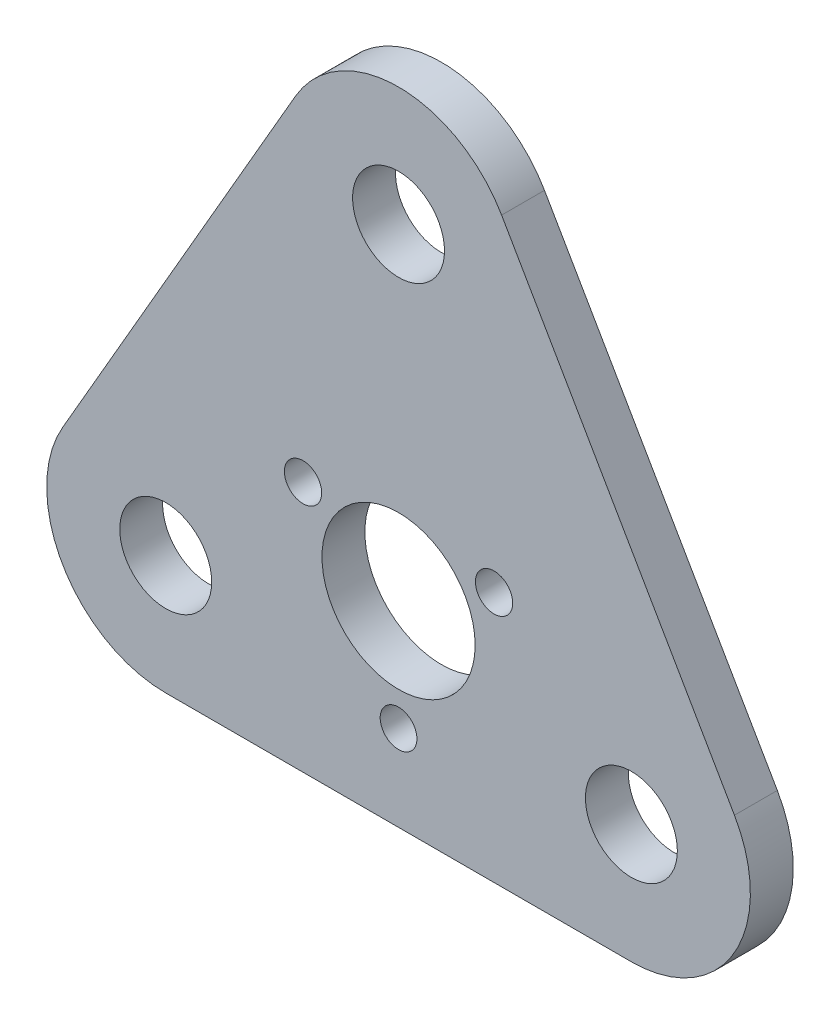
ISO-10303-21;
HEADER;
FILE_DESCRIPTION(('STEP AP214'),'2;1');
FILE_NAME('part.step','',(''),(''),'','','');
FILE_SCHEMA(('AUTOMOTIVE_DESIGN { 1 0 10303 214 1 1 1 1 }'));
ENDSEC;
DATA;
#1=APPLICATION_CONTEXT('core data for automotive mechanical design processes');
#2=APPLICATION_PROTOCOL_DEFINITION('international standard','automotive_design',2000,#1);
#3=PRODUCT_CONTEXT('',#1,'mechanical');
#4=PRODUCT('Part','Part','',(#3));
#5=PRODUCT_RELATED_PRODUCT_CATEGORY('part','',(#4));
#6=PRODUCT_DEFINITION_FORMATION('','',#4);
#7=PRODUCT_DEFINITION_CONTEXT('part definition',#1,'design');
#8=PRODUCT_DEFINITION('design','',#6,#7);
#9=PRODUCT_DEFINITION_SHAPE('','',#8);
#10=(LENGTH_UNIT() NAMED_UNIT(*) SI_UNIT(.MILLI.,.METRE.));
#11=(NAMED_UNIT(*) PLANE_ANGLE_UNIT() SI_UNIT($,.RADIAN.));
#12=(NAMED_UNIT(*) SI_UNIT($,.STERADIAN.) SOLID_ANGLE_UNIT());
#13=UNCERTAINTY_MEASURE_WITH_UNIT(LENGTH_MEASURE(1.E-05),#10,'distance_accuracy_value','');
#14=(GEOMETRIC_REPRESENTATION_CONTEXT(3) GLOBAL_UNCERTAINTY_ASSIGNED_CONTEXT((#13)) GLOBAL_UNIT_ASSIGNED_CONTEXT((#10,
#11,#12)) REPRESENTATION_CONTEXT('',''));
#15=CARTESIAN_POINT('',(0.,0.,0.));
#16=DIRECTION('',(0.,0.,1.));
#17=DIRECTION('',(1.,0.,0.));
#18=AXIS2_PLACEMENT_3D('',#15,#16,#17);
#19=CARTESIAN_POINT('',(38.,-20.3333333333336,7.));
#20=DIRECTION('',(0.,0.,1.));
#21=DIRECTION('',(1.,0.,0.));
#22=AXIS2_PLACEMENT_3D('',#19,#20,#21);
#23=PLANE('',#22);
#24=CARTESIAN_POINT('',(-15.5884572681199,1.2449822014677,7.));
#25=DIRECTION('',(0.,0.,1.));
#26=DIRECTION('',(1.,0.,0.));
#27=AXIS2_PLACEMENT_3D('',#24,#25,#26);
#28=CIRCLE('',#27,3.04265323626427);
#29=CARTESIAN_POINT('',(-12.5458040318556,1.2449822014677,7.));
#30=VERTEX_POINT('',#29);
#31=EDGE_CURVE('E205',#30,#30,#28,.T.);
#32=ORIENTED_EDGE('',*,*,#31,.F.);
#33=EDGE_LOOP('',(#32));
#34=FACE_BOUND('',#33,.T.);
#35=CARTESIAN_POINT('',(0.,-7.75501779853232,7.));
#36=DIRECTION('',(0.,0.,1.));
#37=DIRECTION('',(1.,0.,0.));
#38=AXIS2_PLACEMENT_3D('',#35,#36,#37);
#39=CIRCLE('',#38,12.5);
#40=CARTESIAN_POINT('',(12.5,-7.75501779853232,7.));
#41=VERTEX_POINT('',#40);
#42=EDGE_CURVE('E217',#41,#41,#39,.T.);
#43=ORIENTED_EDGE('',*,*,#42,.F.);
#44=EDGE_LOOP('',(#43));
#45=FACE_BOUND('',#44,.T.);
#46=CARTESIAN_POINT('',(38.,-20.3333333333336,7.));
#47=DIRECTION('',(0.,0.,1.));
#48=DIRECTION('',(1.,0.,0.));
#49=AXIS2_PLACEMENT_3D('',#46,#47,#48);
#50=CIRCLE('',#49,7.5);
#51=CARTESIAN_POINT('',(45.5,-20.3333333333336,7.));
#52=VERTEX_POINT('',#51);
#53=EDGE_CURVE('E229',#52,#52,#50,.T.);
#54=ORIENTED_EDGE('',*,*,#53,.F.);
#55=EDGE_LOOP('',(#54));
#56=FACE_BOUND('',#55,.T.);
#57=CARTESIAN_POINT('',(38.,-20.3333333333336,7.));
#58=DIRECTION('',(0.,0.,1.));
#59=DIRECTION('',(1.,0.,0.));
#60=AXIS2_PLACEMENT_3D('',#57,#58,#59);
#61=CIRCLE('',#60,19.4216844651987);
#62=CARTESIAN_POINT('',(38.,-39.7550177985323,7.));
#63=VERTEX_POINT('',#62);
#64=CARTESIAN_POINT('',(54.8196721311476,-10.6224911007343,7.));
#65=VERTEX_POINT('',#64);
#66=EDGE_CURVE('E133',#63,#65,#61,.T.);
#67=ORIENTED_EDGE('',*,*,#66,.T.);
#68=DIRECTION('',(-0.5,0.866025403784439,0.));
#69=VECTOR('',#68,1.);
#70=CARTESIAN_POINT('',(54.8196721311476,-10.6224911007343,7.));
#71=LINE('',#70,#69);
#72=CARTESIAN_POINT('',(16.8196721311476,55.195439586883,7.));
#73=VERTEX_POINT('',#72);
#74=EDGE_CURVE('E91',#65,#73,#71,.T.);
#75=ORIENTED_EDGE('',*,*,#74,.T.);
#76=CARTESIAN_POINT('',(0.,45.4845973542837,7.));
#77=DIRECTION('',(0.,0.,1.));
#78=DIRECTION('',(-1.,0.,0.));
#79=AXIS2_PLACEMENT_3D('',#76,#77,#78);
#80=CIRCLE('',#79,19.4216844651987);
#81=CARTESIAN_POINT('',(-16.8196721311476,55.195439586883,7.));
#82=VERTEX_POINT('',#81);
#83=EDGE_CURVE('E104',#73,#82,#80,.T.);
#84=ORIENTED_EDGE('',*,*,#83,.T.);
#85=DIRECTION('',(-0.5,-0.866025403784438,0.));
#86=VECTOR('',#85,1.);
#87=CARTESIAN_POINT('',(-16.8196721311476,55.195439586883,7.));
#88=LINE('',#87,#86);
#89=CARTESIAN_POINT('',(-54.8196721311476,-10.6224911007343,7.));
#90=VERTEX_POINT('',#89);
#91=EDGE_CURVE('E98',#82,#90,#88,.T.);
#92=ORIENTED_EDGE('',*,*,#91,.T.);
#93=CARTESIAN_POINT('',(-38.,-20.3333333333337,7.));
#94=DIRECTION('',(0.,0.,1.));
#95=DIRECTION('',(1.,0.,0.));
#96=AXIS2_PLACEMENT_3D('',#93,#94,#95);
#97=CIRCLE('',#96,19.4216844651987);
#98=CARTESIAN_POINT('',(-38.,-39.7550177985323,7.));
#99=VERTEX_POINT('',#98);
#100=EDGE_CURVE('E102',#90,#99,#97,.T.);
#101=ORIENTED_EDGE('',*,*,#100,.T.);
#102=DIRECTION('',(1.,0.,0.));
#103=VECTOR('',#102,1.);
#104=CARTESIAN_POINT('',(-38.,-39.7550177985323,7.));
#105=LINE('',#104,#103);
#106=EDGE_CURVE('E54',#99,#63,#105,.T.);
#107=ORIENTED_EDGE('',*,*,#106,.T.);
#108=EDGE_LOOP('',(#67,#75,#84,#92,#101,#107));
#109=FACE_BOUND('',#108,.T.);
#110=CARTESIAN_POINT('',(0.,45.4845973542837,7.));
#111=DIRECTION('',(0.,0.,1.));
#112=DIRECTION('',(1.,0.,0.));
#113=AXIS2_PLACEMENT_3D('',#110,#111,#112);
#114=CIRCLE('',#113,7.5);
#115=CARTESIAN_POINT('',(7.5,45.4845973542837,7.));
#116=VERTEX_POINT('',#115);
#117=EDGE_CURVE('E126',#116,#116,#114,.T.);
#118=ORIENTED_EDGE('',*,*,#117,.F.);
#119=EDGE_LOOP('',(#118));
#120=FACE_BOUND('',#119,.T.);
#121=CARTESIAN_POINT('',(-38.,-20.3333333333337,7.));
#122=DIRECTION('',(0.,0.,1.));
#123=DIRECTION('',(1.,0.,0.));
#124=AXIS2_PLACEMENT_3D('',#121,#122,#123);
#125=CIRCLE('',#124,7.5);
#126=CARTESIAN_POINT('',(-30.5,-20.3333333333337,7.));
#127=VERTEX_POINT('',#126);
#128=EDGE_CURVE('E223',#127,#127,#125,.T.);
#129=ORIENTED_EDGE('',*,*,#128,.F.);
#130=EDGE_LOOP('',(#129));
#131=FACE_BOUND('',#130,.T.);
#132=CARTESIAN_POINT('',(0.,-25.7550177985323,7.));
#133=DIRECTION('',(0.,0.,1.));
#134=DIRECTION('',(1.,0.,0.));
#135=AXIS2_PLACEMENT_3D('',#132,#133,#134);
#136=CIRCLE('',#135,3.);
#137=CARTESIAN_POINT('',(3.,-25.7550177985323,7.));
#138=VERTEX_POINT('',#137);
#139=EDGE_CURVE('E211',#138,#138,#136,.T.);
#140=ORIENTED_EDGE('',*,*,#139,.F.);
#141=EDGE_LOOP('',(#140));
#142=FACE_BOUND('',#141,.T.);
#143=CARTESIAN_POINT('',(15.5884572681199,1.2449822014677,7.));
#144=DIRECTION('',(0.,0.,1.));
#145=DIRECTION('',(-1.,0.,0.));
#146=AXIS2_PLACEMENT_3D('',#143,#144,#145);
#147=CIRCLE('',#146,3.04265323626427);
#148=CARTESIAN_POINT('',(12.5458040318556,1.2449822014677,7.));
#149=VERTEX_POINT('',#148);
#150=EDGE_CURVE('E196',#149,#149,#147,.T.);
#151=ORIENTED_EDGE('',*,*,#150,.F.);
#152=EDGE_LOOP('',(#151));
#153=FACE_BOUND('',#152,.T.);
#154=ADVANCED_FACE('F37',(#34,#45,#56,#109,#120,#131,#142,#153),#23,.T.);
#155=CARTESIAN_POINT('',(38.,-20.3333333333336,0.));
#156=DIRECTION('',(0.,0.,1.));
#157=DIRECTION('',(1.,0.,0.));
#158=AXIS2_PLACEMENT_3D('',#155,#156,#157);
#159=PLANE('',#158);
#160=CARTESIAN_POINT('',(38.,-20.3333333333336,0.));
#161=DIRECTION('',(0.,0.,1.));
#162=DIRECTION('',(1.,0.,0.));
#163=AXIS2_PLACEMENT_3D('',#160,#161,#162);
#164=CIRCLE('',#163,19.4216844651987);
#165=CARTESIAN_POINT('',(38.,-39.7550177985323,0.));
#166=VERTEX_POINT('',#165);
#167=CARTESIAN_POINT('',(54.8196721311476,-10.6224911007343,0.));
#168=VERTEX_POINT('',#167);
#169=EDGE_CURVE('E122',#166,#168,#164,.T.);
#170=ORIENTED_EDGE('',*,*,#169,.F.);
#171=DIRECTION('',(1.,0.,0.));
#172=VECTOR('',#171,1.);
#173=CARTESIAN_POINT('',(-38.,-39.7550177985323,0.));
#174=LINE('',#173,#172);
#175=CARTESIAN_POINT('',(-38.,-39.7550177985323,0.));
#176=VERTEX_POINT('',#175);
#177=EDGE_CURVE('E83',#176,#166,#174,.T.);
#178=ORIENTED_EDGE('',*,*,#177,.F.);
#179=CARTESIAN_POINT('',(-38.,-20.3333333333337,0.));
#180=DIRECTION('',(0.,0.,1.));
#181=DIRECTION('',(1.,0.,0.));
#182=AXIS2_PLACEMENT_3D('',#179,#180,#181);
#183=CIRCLE('',#182,19.4216844651987);
#184=CARTESIAN_POINT('',(-54.8196721311476,-10.6224911007343,0.));
#185=VERTEX_POINT('',#184);
#186=EDGE_CURVE('E77',#185,#176,#183,.T.);
#187=ORIENTED_EDGE('',*,*,#186,.F.);
#188=DIRECTION('',(-0.5,-0.866025403784438,0.));
#189=VECTOR('',#188,1.);
#190=CARTESIAN_POINT('',(-16.8196721311476,55.195439586883,0.));
#191=LINE('',#190,#189);
#192=CARTESIAN_POINT('',(-16.8196721311476,55.195439586883,0.));
#193=VERTEX_POINT('',#192);
#194=EDGE_CURVE('E112',#193,#185,#191,.T.);
#195=ORIENTED_EDGE('',*,*,#194,.F.);
#196=CARTESIAN_POINT('',(0.,45.4845973542837,0.));
#197=DIRECTION('',(0.,0.,1.));
#198=DIRECTION('',(-1.,0.,0.));
#199=AXIS2_PLACEMENT_3D('',#196,#197,#198);
#200=CIRCLE('',#199,19.4216844651987);
#201=CARTESIAN_POINT('',(16.8196721311476,55.195439586883,0.));
#202=VERTEX_POINT('',#201);
#203=EDGE_CURVE('E128',#202,#193,#200,.T.);
#204=ORIENTED_EDGE('',*,*,#203,.F.);
#205=DIRECTION('',(-0.5,0.866025403784439,0.));
#206=VECTOR('',#205,1.);
#207=CARTESIAN_POINT('',(54.8196721311476,-10.6224911007343,0.));
#208=LINE('',#207,#206);
#209=EDGE_CURVE('E125',#168,#202,#208,.T.);
#210=ORIENTED_EDGE('',*,*,#209,.F.);
#211=EDGE_LOOP('',(#170,#178,#187,#195,#204,#210));
#212=FACE_BOUND('',#211,.T.);
#213=CARTESIAN_POINT('',(0.,45.4845973542837,0.));
#214=DIRECTION('',(0.,0.,1.));
#215=DIRECTION('',(1.,0.,0.));
#216=AXIS2_PLACEMENT_3D('',#213,#214,#215);
#217=CIRCLE('',#216,7.5);
#218=CARTESIAN_POINT('',(7.5,45.4845973542837,0.));
#219=VERTEX_POINT('',#218);
#220=EDGE_CURVE('E232',#219,#219,#217,.T.);
#221=ORIENTED_EDGE('',*,*,#220,.T.);
#222=EDGE_LOOP('',(#221));
#223=FACE_BOUND('',#222,.T.);
#224=CARTESIAN_POINT('',(38.,-20.3333333333336,0.));
#225=DIRECTION('',(0.,0.,1.));
#226=DIRECTION('',(1.,0.,0.));
#227=AXIS2_PLACEMENT_3D('',#224,#225,#226);
#228=CIRCLE('',#227,7.5);
#229=CARTESIAN_POINT('',(45.5,-20.3333333333336,0.));
#230=VERTEX_POINT('',#229);
#231=EDGE_CURVE('E226',#230,#230,#228,.T.);
#232=ORIENTED_EDGE('',*,*,#231,.T.);
#233=EDGE_LOOP('',(#232));
#234=FACE_BOUND('',#233,.T.);
#235=CARTESIAN_POINT('',(-38.,-20.3333333333337,0.));
#236=DIRECTION('',(0.,0.,1.));
#237=DIRECTION('',(1.,0.,0.));
#238=AXIS2_PLACEMENT_3D('',#235,#236,#237);
#239=CIRCLE('',#238,7.5);
#240=CARTESIAN_POINT('',(-30.5,-20.3333333333337,0.));
#241=VERTEX_POINT('',#240);
#242=EDGE_CURVE('E220',#241,#241,#239,.T.);
#243=ORIENTED_EDGE('',*,*,#242,.T.);
#244=EDGE_LOOP('',(#243));
#245=FACE_BOUND('',#244,.T.);
#246=CARTESIAN_POINT('',(0.,-7.75501779853232,0.));
#247=DIRECTION('',(0.,0.,1.));
#248=DIRECTION('',(1.,0.,0.));
#249=AXIS2_PLACEMENT_3D('',#246,#247,#248);
#250=CIRCLE('',#249,12.5);
#251=CARTESIAN_POINT('',(12.5,-7.75501779853232,0.));
#252=VERTEX_POINT('',#251);
#253=EDGE_CURVE('E214',#252,#252,#250,.T.);
#254=ORIENTED_EDGE('',*,*,#253,.T.);
#255=EDGE_LOOP('',(#254));
#256=FACE_BOUND('',#255,.T.);
#257=CARTESIAN_POINT('',(0.,-25.7550177985323,0.));
#258=DIRECTION('',(0.,0.,1.));
#259=DIRECTION('',(1.,0.,0.));
#260=AXIS2_PLACEMENT_3D('',#257,#258,#259);
#261=CIRCLE('',#260,3.);
#262=CARTESIAN_POINT('',(3.,-25.7550177985323,0.));
#263=VERTEX_POINT('',#262);
#264=EDGE_CURVE('E208',#263,#263,#261,.T.);
#265=ORIENTED_EDGE('',*,*,#264,.T.);
#266=EDGE_LOOP('',(#265));
#267=FACE_BOUND('',#266,.T.);
#268=CARTESIAN_POINT('',(-15.5884572681199,1.2449822014677,0.));
#269=DIRECTION('',(0.,0.,1.));
#270=DIRECTION('',(1.,0.,0.));
#271=AXIS2_PLACEMENT_3D('',#268,#269,#270);
#272=CIRCLE('',#271,3.04265323626427);
#273=CARTESIAN_POINT('',(-12.5458040318556,1.2449822014677,0.));
#274=VERTEX_POINT('',#273);
#275=EDGE_CURVE('E202',#274,#274,#272,.T.);
#276=ORIENTED_EDGE('',*,*,#275,.T.);
#277=EDGE_LOOP('',(#276));
#278=FACE_BOUND('',#277,.T.);
#279=CARTESIAN_POINT('',(15.5884572681199,1.2449822014677,0.));
#280=DIRECTION('',(0.,0.,1.));
#281=DIRECTION('',(-1.,0.,0.));
#282=AXIS2_PLACEMENT_3D('',#279,#280,#281);
#283=CIRCLE('',#282,3.04265323626427);
#284=CARTESIAN_POINT('',(12.5458040318556,1.2449822014677,0.));
#285=VERTEX_POINT('',#284);
#286=EDGE_CURVE('E199',#285,#285,#283,.T.);
#287=ORIENTED_EDGE('',*,*,#286,.T.);
#288=EDGE_LOOP('',(#287));
#289=FACE_BOUND('',#288,.T.);
#290=ADVANCED_FACE('F142',(#212,#223,#234,#245,#256,#267,#278,#289),#159,.F.);
#291=CARTESIAN_POINT('',(38.,-20.3333333333336,7.));
#292=DIRECTION('',(0.,0.,-1.));
#293=DIRECTION('',(-1.,0.,0.));
#294=AXIS2_PLACEMENT_3D('',#291,#292,#293);
#295=CYLINDRICAL_SURFACE('',#294,19.4216844651987);
#296=ORIENTED_EDGE('',*,*,#169,.T.);
#297=DIRECTION('',(0.,0.,-1.));
#298=VECTOR('',#297,1.);
#299=CARTESIAN_POINT('',(54.8196721311476,-10.6224911007343,7.));
#300=LINE('',#299,#298);
#301=EDGE_CURVE('E11',#65,#168,#300,.T.);
#302=ORIENTED_EDGE('',*,*,#301,.F.);
#303=ORIENTED_EDGE('',*,*,#66,.F.);
#304=DIRECTION('',(0.,0.,-1.));
#305=VECTOR('',#304,1.);
#306=CARTESIAN_POINT('',(38.,-39.7550177985323,7.));
#307=LINE('',#306,#305);
#308=EDGE_CURVE('E118',#63,#166,#307,.T.);
#309=ORIENTED_EDGE('',*,*,#308,.T.);
#310=EDGE_LOOP('',(#296,#302,#303,#309));
#311=FACE_BOUND('',#310,.T.);
#312=ADVANCED_FACE('F39',(#311),#295,.T.);
#313=CARTESIAN_POINT('',(54.8196721311476,-10.6224911007343,7.));
#314=DIRECTION('',(-0.866025403784439,-0.5,0.));
#315=DIRECTION('',(0.5,-0.866025403784439,0.));
#316=AXIS2_PLACEMENT_3D('',#313,#314,#315);
#317=PLANE('',#316);
#318=ORIENTED_EDGE('',*,*,#209,.T.);
#319=DIRECTION('',(0.,0.,-1.));
#320=VECTOR('',#319,1.);
#321=CARTESIAN_POINT('',(16.8196721311476,55.195439586883,7.));
#322=LINE('',#321,#320);
#323=EDGE_CURVE('E46',#73,#202,#322,.T.);
#324=ORIENTED_EDGE('',*,*,#323,.F.);
#325=ORIENTED_EDGE('',*,*,#74,.F.);
#326=ORIENTED_EDGE('',*,*,#301,.T.);
#327=EDGE_LOOP('',(#318,#324,#325,#326));
#328=FACE_BOUND('',#327,.T.);
#329=ADVANCED_FACE('F317',(#328),#317,.F.);
#330=CARTESIAN_POINT('',(0.,45.4845973542837,7.));
#331=DIRECTION('',(0.,0.,-1.));
#332=DIRECTION('',(-1.,0.,0.));
#333=AXIS2_PLACEMENT_3D('',#330,#331,#332);
#334=CYLINDRICAL_SURFACE('',#333,19.4216844651987);
#335=ORIENTED_EDGE('',*,*,#203,.T.);
#336=DIRECTION('',(0.,0.,-1.));
#337=VECTOR('',#336,1.);
#338=CARTESIAN_POINT('',(-16.8196721311476,55.195439586883,7.));
#339=LINE('',#338,#337);
#340=EDGE_CURVE('E113',#82,#193,#339,.T.);
#341=ORIENTED_EDGE('',*,*,#340,.F.);
#342=ORIENTED_EDGE('',*,*,#83,.F.);
#343=ORIENTED_EDGE('',*,*,#323,.T.);
#344=EDGE_LOOP('',(#335,#341,#342,#343));
#345=FACE_BOUND('',#344,.T.);
#346=ADVANCED_FACE('F139',(#345),#334,.T.);
#347=CARTESIAN_POINT('',(-16.8196721311476,55.195439586883,7.));
#348=DIRECTION('',(0.866025403784438,-0.5,0.));
#349=DIRECTION('',(0.5,0.866025403784438,0.));
#350=AXIS2_PLACEMENT_3D('',#347,#348,#349);
#351=PLANE('',#350);
#352=ORIENTED_EDGE('',*,*,#194,.T.);
#353=DIRECTION('',(0.,0.,-1.));
#354=VECTOR('',#353,1.);
#355=CARTESIAN_POINT('',(-54.8196721311476,-10.6224911007343,7.));
#356=LINE('',#355,#354);
#357=EDGE_CURVE('E109',#90,#185,#356,.T.);
#358=ORIENTED_EDGE('',*,*,#357,.F.);
#359=ORIENTED_EDGE('',*,*,#91,.F.);
#360=ORIENTED_EDGE('',*,*,#340,.T.);
#361=EDGE_LOOP('',(#352,#358,#359,#360));
#362=FACE_BOUND('',#361,.T.);
#363=ADVANCED_FACE('F110',(#362),#351,.F.);
#364=CARTESIAN_POINT('',(-38.,-20.3333333333337,7.));
#365=DIRECTION('',(0.,0.,-1.));
#366=DIRECTION('',(-1.,0.,0.));
#367=AXIS2_PLACEMENT_3D('',#364,#365,#366);
#368=CYLINDRICAL_SURFACE('',#367,19.4216844651987);
#369=ORIENTED_EDGE('',*,*,#186,.T.);
#370=DIRECTION('',(0.,0.,-1.));
#371=VECTOR('',#370,1.);
#372=CARTESIAN_POINT('',(-38.,-39.7550177985323,7.));
#373=LINE('',#372,#371);
#374=EDGE_CURVE('E114',#99,#176,#373,.T.);
#375=ORIENTED_EDGE('',*,*,#374,.F.);
#376=ORIENTED_EDGE('',*,*,#100,.F.);
#377=ORIENTED_EDGE('',*,*,#357,.T.);
#378=EDGE_LOOP('',(#369,#375,#376,#377));
#379=FACE_BOUND('',#378,.T.);
#380=ADVANCED_FACE('F116',(#379),#368,.T.);
#381=CARTESIAN_POINT('',(-38.,-39.7550177985323,7.));
#382=DIRECTION('',(0.,1.,0.));
#383=DIRECTION('',(-1.,0.,0.));
#384=AXIS2_PLACEMENT_3D('',#381,#382,#383);
#385=PLANE('',#384);
#386=ORIENTED_EDGE('',*,*,#177,.T.);
#387=ORIENTED_EDGE('',*,*,#308,.F.);
#388=ORIENTED_EDGE('',*,*,#106,.F.);
#389=ORIENTED_EDGE('',*,*,#374,.T.);
#390=EDGE_LOOP('',(#386,#387,#388,#389));
#391=FACE_BOUND('',#390,.T.);
#392=ADVANCED_FACE('F147',(#391),#385,.F.);
#393=CARTESIAN_POINT('',(0.,45.4845973542837,7.));
#394=DIRECTION('',(0.,0.,-1.));
#395=DIRECTION('',(-1.,0.,0.));
#396=AXIS2_PLACEMENT_3D('',#393,#394,#395);
#397=CYLINDRICAL_SURFACE('',#396,7.5);
#398=ORIENTED_EDGE('',*,*,#117,.T.);
#399=EDGE_LOOP('',(#398));
#400=FACE_BOUND('',#399,.T.);
#401=ORIENTED_EDGE('',*,*,#220,.F.);
#402=EDGE_LOOP('',(#401));
#403=FACE_BOUND('',#402,.T.);
#404=ADVANCED_FACE('F149',(#400,#403),#397,.F.);
#405=CARTESIAN_POINT('',(38.,-20.3333333333336,7.));
#406=DIRECTION('',(0.,0.,-1.));
#407=DIRECTION('',(-1.,0.,0.));
#408=AXIS2_PLACEMENT_3D('',#405,#406,#407);
#409=CYLINDRICAL_SURFACE('',#408,7.5);
#410=ORIENTED_EDGE('',*,*,#53,.T.);
#411=EDGE_LOOP('',(#410));
#412=FACE_BOUND('',#411,.T.);
#413=ORIENTED_EDGE('',*,*,#231,.F.);
#414=EDGE_LOOP('',(#413));
#415=FACE_BOUND('',#414,.T.);
#416=ADVANCED_FACE('F155',(#412,#415),#409,.F.);
#417=CARTESIAN_POINT('',(-38.,-20.3333333333337,7.));
#418=DIRECTION('',(0.,0.,-1.));
#419=DIRECTION('',(-1.,0.,0.));
#420=AXIS2_PLACEMENT_3D('',#417,#418,#419);
#421=CYLINDRICAL_SURFACE('',#420,7.5);
#422=ORIENTED_EDGE('',*,*,#128,.T.);
#423=EDGE_LOOP('',(#422));
#424=FACE_BOUND('',#423,.T.);
#425=ORIENTED_EDGE('',*,*,#242,.F.);
#426=EDGE_LOOP('',(#425));
#427=FACE_BOUND('',#426,.T.);
#428=ADVANCED_FACE('F171',(#424,#427),#421,.F.);
#429=CARTESIAN_POINT('',(0.,-7.75501779853232,7.));
#430=DIRECTION('',(0.,0.,-1.));
#431=DIRECTION('',(-1.,0.,0.));
#432=AXIS2_PLACEMENT_3D('',#429,#430,#431);
#433=CYLINDRICAL_SURFACE('',#432,12.5);
#434=ORIENTED_EDGE('',*,*,#42,.T.);
#435=EDGE_LOOP('',(#434));
#436=FACE_BOUND('',#435,.T.);
#437=ORIENTED_EDGE('',*,*,#253,.F.);
#438=EDGE_LOOP('',(#437));
#439=FACE_BOUND('',#438,.T.);
#440=ADVANCED_FACE('F175',(#436,#439),#433,.F.);
#441=CARTESIAN_POINT('',(0.,-25.7550177985323,7.));
#442=DIRECTION('',(0.,0.,-1.));
#443=DIRECTION('',(-1.,0.,0.));
#444=AXIS2_PLACEMENT_3D('',#441,#442,#443);
#445=CYLINDRICAL_SURFACE('',#444,3.);
#446=ORIENTED_EDGE('',*,*,#139,.T.);
#447=EDGE_LOOP('',(#446));
#448=FACE_BOUND('',#447,.T.);
#449=ORIENTED_EDGE('',*,*,#264,.F.);
#450=EDGE_LOOP('',(#449));
#451=FACE_BOUND('',#450,.T.);
#452=ADVANCED_FACE('F179',(#448,#451),#445,.F.);
#453=CARTESIAN_POINT('',(-15.5884572681199,1.2449822014677,7.));
#454=DIRECTION('',(0.,0.,-1.));
#455=DIRECTION('',(-1.,0.,0.));
#456=AXIS2_PLACEMENT_3D('',#453,#454,#455);
#457=CYLINDRICAL_SURFACE('',#456,3.04265323626427);
#458=ORIENTED_EDGE('',*,*,#31,.T.);
#459=EDGE_LOOP('',(#458));
#460=FACE_BOUND('',#459,.T.);
#461=ORIENTED_EDGE('',*,*,#275,.F.);
#462=EDGE_LOOP('',(#461));
#463=FACE_BOUND('',#462,.T.);
#464=ADVANCED_FACE('F183',(#460,#463),#457,.F.);
#465=CARTESIAN_POINT('',(15.5884572681199,1.2449822014677,7.));
#466=DIRECTION('',(0.,0.,-1.));
#467=DIRECTION('',(-1.,0.,0.));
#468=AXIS2_PLACEMENT_3D('',#465,#466,#467);
#469=CYLINDRICAL_SURFACE('',#468,3.04265323626427);
#470=ORIENTED_EDGE('',*,*,#150,.T.);
#471=EDGE_LOOP('',(#470));
#472=FACE_BOUND('',#471,.T.);
#473=ORIENTED_EDGE('',*,*,#286,.F.);
#474=EDGE_LOOP('',(#473));
#475=FACE_BOUND('',#474,.T.);
#476=ADVANCED_FACE('F187',(#472,#475),#469,.F.);
#477=CLOSED_SHELL('',(#154,#290,#312,#329,#346,#363,#380,#392,#404,#416,#428,#440,#452,#464,#476));
#478=MANIFOLD_SOLID_BREP('B2',#477);
#479=ADVANCED_BREP_SHAPE_REPRESENTATION('',(#18,#478),#14);
#480=SHAPE_DEFINITION_REPRESENTATION(#9,#479);
ENDSEC;
END-ISO-10303-21;
